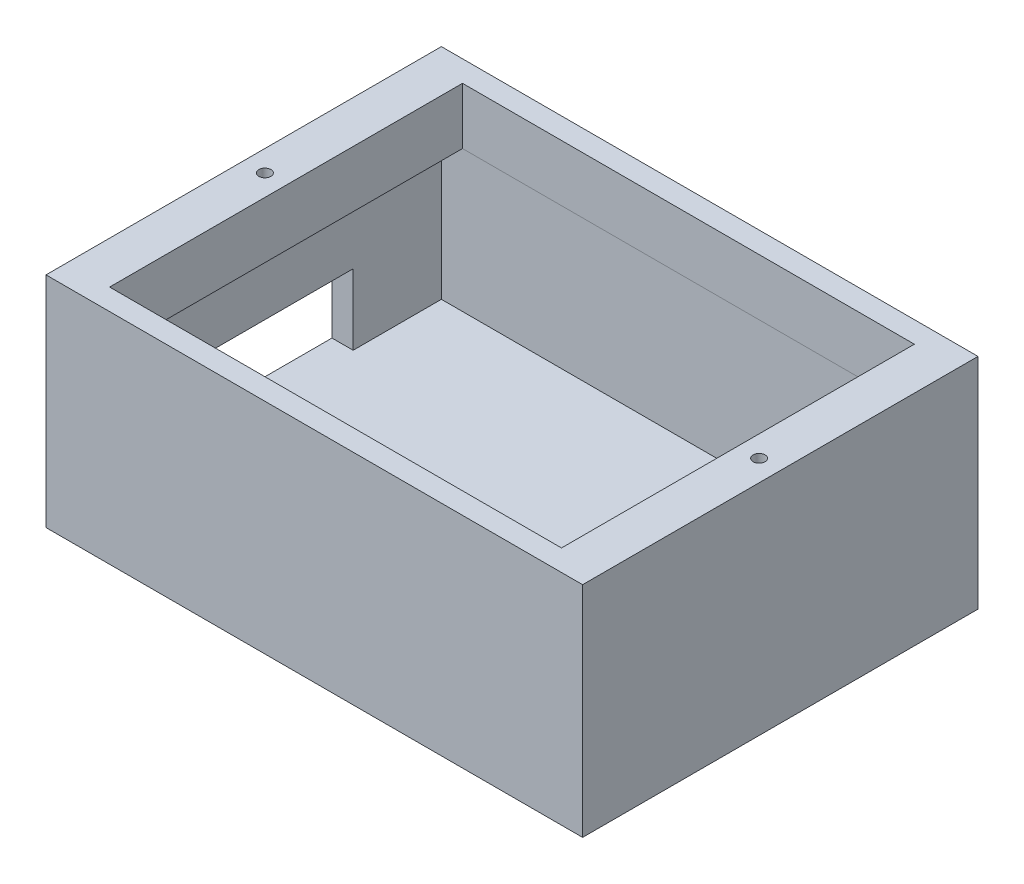
ISO-10303-21;
HEADER;
FILE_DESCRIPTION(('STEP AP214'),'2;1');
FILE_NAME('part.step','',(''),(''),'','','');
FILE_SCHEMA(('AUTOMOTIVE_DESIGN { 1 0 10303 214 1 1 1 1 }'));
ENDSEC;
DATA;
#1=APPLICATION_CONTEXT('core data for automotive mechanical design processes');
#2=APPLICATION_PROTOCOL_DEFINITION('international standard','automotive_design',2000,#1);
#3=PRODUCT_CONTEXT('',#1,'mechanical');
#4=PRODUCT('Part','Part','',(#3));
#5=PRODUCT_RELATED_PRODUCT_CATEGORY('part','',(#4));
#6=PRODUCT_DEFINITION_FORMATION('','',#4);
#7=PRODUCT_DEFINITION_CONTEXT('part definition',#1,'design');
#8=PRODUCT_DEFINITION('design','',#6,#7);
#9=PRODUCT_DEFINITION_SHAPE('','',#8);
#10=(LENGTH_UNIT() NAMED_UNIT(*) SI_UNIT(.MILLI.,.METRE.));
#11=(NAMED_UNIT(*) PLANE_ANGLE_UNIT() SI_UNIT($,.RADIAN.));
#12=(NAMED_UNIT(*) SI_UNIT($,.STERADIAN.) SOLID_ANGLE_UNIT());
#13=UNCERTAINTY_MEASURE_WITH_UNIT(LENGTH_MEASURE(1.E-05),#10,'distance_accuracy_value','');
#14=(GEOMETRIC_REPRESENTATION_CONTEXT(3) GLOBAL_UNCERTAINTY_ASSIGNED_CONTEXT((#13)) GLOBAL_UNIT_ASSIGNED_CONTEXT((#10,
#11,#12)) REPRESENTATION_CONTEXT('',''));
#15=CARTESIAN_POINT('',(0.,0.,0.));
#16=DIRECTION('',(0.,0.,1.));
#17=DIRECTION('',(1.,0.,0.));
#18=AXIS2_PLACEMENT_3D('',#15,#16,#17);
#19=CARTESIAN_POINT('',(-35.,31.,25.));
#20=DIRECTION('',(0.,0.,-1.));
#21=DIRECTION('',(-1.,0.,0.));
#22=AXIS2_PLACEMENT_3D('',#19,#20,#21);
#23=PLANE('',#22);
#24=DIRECTION('',(0.,-1.,0.));
#25=VECTOR('',#24,1.);
#26=CARTESIAN_POINT('',(-35.,31.,25.));
#27=LINE('',#26,#25);
#28=CARTESIAN_POINT('',(-35.,23.,25.));
#29=VERTEX_POINT('',#28);
#30=CARTESIAN_POINT('',(-35.,3.,25.));
#31=VERTEX_POINT('',#30);
#32=EDGE_CURVE('E244',#29,#31,#27,.T.);
#33=ORIENTED_EDGE('',*,*,#32,.F.);
#34=DIRECTION('',(1.,0.,0.));
#35=VECTOR('',#34,1.);
#36=CARTESIAN_POINT('',(0.,23.,25.));
#37=LINE('',#36,#35);
#38=CARTESIAN_POINT('',(35.,23.,25.));
#39=VERTEX_POINT('',#38);
#40=EDGE_CURVE('E51',#29,#39,#37,.T.);
#41=ORIENTED_EDGE('',*,*,#40,.T.);
#42=DIRECTION('',(0.,-1.,0.));
#43=VECTOR('',#42,1.);
#44=CARTESIAN_POINT('',(35.,31.,25.));
#45=LINE('',#44,#43);
#46=CARTESIAN_POINT('',(35.,3.,25.));
#47=VERTEX_POINT('',#46);
#48=EDGE_CURVE('E250',#39,#47,#45,.T.);
#49=ORIENTED_EDGE('',*,*,#48,.T.);
#50=DIRECTION('',(1.,0.,0.));
#51=VECTOR('',#50,1.);
#52=CARTESIAN_POINT('',(-35.,3.,25.));
#53=LINE('',#52,#51);
#54=EDGE_CURVE('E231',#31,#47,#53,.T.);
#55=ORIENTED_EDGE('',*,*,#54,.F.);
#56=EDGE_LOOP('',(#33,#41,#49,#55));
#57=FACE_BOUND('',#56,.T.);
#58=ADVANCED_FACE('F36',(#57),#23,.T.);
#59=CARTESIAN_POINT('',(35.,31.,25.));
#60=DIRECTION('',(-1.,0.,0.));
#61=DIRECTION('',(0.,0.,1.));
#62=AXIS2_PLACEMENT_3D('',#59,#60,#61);
#63=PLANE('',#62);
#64=ORIENTED_EDGE('',*,*,#48,.F.);
#65=DIRECTION('',(0.,0.,-1.));
#66=VECTOR('',#65,1.);
#67=CARTESIAN_POINT('',(35.,23.,0.));
#68=LINE('',#67,#66);
#69=CARTESIAN_POINT('',(35.,23.,-25.));
#70=VERTEX_POINT('',#69);
#71=EDGE_CURVE('E196',#39,#70,#68,.T.);
#72=ORIENTED_EDGE('',*,*,#71,.T.);
#73=DIRECTION('',(0.,-1.,0.));
#74=VECTOR('',#73,1.);
#75=CARTESIAN_POINT('',(35.,31.,-25.));
#76=LINE('',#75,#74);
#77=CARTESIAN_POINT('',(35.,3.,-25.));
#78=VERTEX_POINT('',#77);
#79=EDGE_CURVE('E248',#70,#78,#76,.T.);
#80=ORIENTED_EDGE('',*,*,#79,.T.);
#81=DIRECTION('',(0.,0.,-1.));
#82=VECTOR('',#81,1.);
#83=CARTESIAN_POINT('',(35.,3.,25.));
#84=LINE('',#83,#82);
#85=EDGE_CURVE('E234',#47,#78,#84,.T.);
#86=ORIENTED_EDGE('',*,*,#85,.F.);
#87=EDGE_LOOP('',(#64,#72,#80,#86));
#88=FACE_BOUND('',#87,.T.);
#89=ADVANCED_FACE('F307',(#88),#63,.T.);
#90=CARTESIAN_POINT('',(-35.,31.,-25.));
#91=DIRECTION('',(0.,0.,1.));
#92=DIRECTION('',(1.,0.,0.));
#93=AXIS2_PLACEMENT_3D('',#90,#91,#92);
#94=PLANE('',#93);
#95=ORIENTED_EDGE('',*,*,#79,.F.);
#96=DIRECTION('',(-1.,0.,0.));
#97=VECTOR('',#96,1.);
#98=CARTESIAN_POINT('',(0.,23.,-25.));
#99=LINE('',#98,#97);
#100=CARTESIAN_POINT('',(-35.,23.,-25.));
#101=VERTEX_POINT('',#100);
#102=EDGE_CURVE('E199',#70,#101,#99,.T.);
#103=ORIENTED_EDGE('',*,*,#102,.T.);
#104=DIRECTION('',(0.,-1.,0.));
#105=VECTOR('',#104,1.);
#106=CARTESIAN_POINT('',(-35.,31.,-25.));
#107=LINE('',#106,#105);
#108=CARTESIAN_POINT('',(-35.,3.,-25.));
#109=VERTEX_POINT('',#108);
#110=EDGE_CURVE('E246',#101,#109,#107,.T.);
#111=ORIENTED_EDGE('',*,*,#110,.T.);
#112=DIRECTION('',(-1.,0.,0.));
#113=VECTOR('',#112,1.);
#114=CARTESIAN_POINT('',(-35.,3.,-25.));
#115=LINE('',#114,#113);
#116=EDGE_CURVE('E237',#78,#109,#115,.T.);
#117=ORIENTED_EDGE('',*,*,#116,.F.);
#118=EDGE_LOOP('',(#95,#103,#111,#117));
#119=FACE_BOUND('',#118,.T.);
#120=ADVANCED_FACE('F313',(#119),#94,.T.);
#121=CARTESIAN_POINT('',(-35.,31.,25.));
#122=DIRECTION('',(1.,0.,0.));
#123=DIRECTION('',(0.,0.,-1.));
#124=AXIS2_PLACEMENT_3D('',#121,#122,#123);
#125=PLANE('',#124);
#126=ORIENTED_EDGE('',*,*,#110,.F.);
#127=DIRECTION('',(0.,0.,1.));
#128=VECTOR('',#127,1.);
#129=CARTESIAN_POINT('',(-35.,23.,0.));
#130=LINE('',#129,#128);
#131=EDGE_CURVE('E202',#101,#29,#130,.T.);
#132=ORIENTED_EDGE('',*,*,#131,.T.);
#133=ORIENTED_EDGE('',*,*,#32,.T.);
#134=DIRECTION('',(0.,0.,1.));
#135=VECTOR('',#134,1.);
#136=CARTESIAN_POINT('',(-35.,3.,25.));
#137=LINE('',#136,#135);
#138=CARTESIAN_POINT('',(-35.,3.,12.5));
#139=VERTEX_POINT('',#138);
#140=EDGE_CURVE('E240',#139,#31,#137,.T.);
#141=ORIENTED_EDGE('',*,*,#140,.F.);
#142=DIRECTION('',(0.,1.,0.));
#143=VECTOR('',#142,1.);
#144=CARTESIAN_POINT('',(-35.,3.,12.5));
#145=LINE('',#144,#143);
#146=CARTESIAN_POINT('',(-35.,13.,12.5));
#147=VERTEX_POINT('',#146);
#148=EDGE_CURVE('E207',#139,#147,#145,.T.);
#149=ORIENTED_EDGE('',*,*,#148,.T.);
#150=DIRECTION('',(0.,0.,-1.));
#151=VECTOR('',#150,1.);
#152=CARTESIAN_POINT('',(-35.,13.,-12.5));
#153=LINE('',#152,#151);
#154=CARTESIAN_POINT('',(-35.,13.,-12.5));
#155=VERTEX_POINT('',#154);
#156=EDGE_CURVE('E223',#147,#155,#153,.T.);
#157=ORIENTED_EDGE('',*,*,#156,.T.);
#158=DIRECTION('',(0.,-1.,0.));
#159=VECTOR('',#158,1.);
#160=CARTESIAN_POINT('',(-35.,3.,-12.5));
#161=LINE('',#160,#159);
#162=CARTESIAN_POINT('',(-35.,3.,-12.5));
#163=VERTEX_POINT('',#162);
#164=EDGE_CURVE('E204',#155,#163,#161,.T.);
#165=ORIENTED_EDGE('',*,*,#164,.T.);
#166=EDGE_CURVE('E241',#109,#163,#137,.T.);
#167=ORIENTED_EDGE('',*,*,#166,.F.);
#168=EDGE_LOOP('',(#126,#132,#133,#141,#149,#157,#165,#167));
#169=FACE_BOUND('',#168,.T.);
#170=ADVANCED_FACE('F305',(#169),#125,.T.);
#171=CARTESIAN_POINT('',(38.,3.,28.));
#172=DIRECTION('',(-1.,0.,0.));
#173=DIRECTION('',(0.,0.,1.));
#174=AXIS2_PLACEMENT_3D('',#171,#172,#173);
#175=PLANE('',#174);
#176=DIRECTION('',(0.,0.,-1.));
#177=VECTOR('',#176,1.);
#178=CARTESIAN_POINT('',(38.,0.,28.));
#179=LINE('',#178,#177);
#180=CARTESIAN_POINT('',(38.,0.,28.));
#181=VERTEX_POINT('',#180);
#182=CARTESIAN_POINT('',(38.,0.,-28.));
#183=VERTEX_POINT('',#182);
#184=EDGE_CURVE('E264',#181,#183,#179,.T.);
#185=ORIENTED_EDGE('',*,*,#184,.T.);
#186=DIRECTION('',(0.,-1.,0.));
#187=VECTOR('',#186,1.);
#188=CARTESIAN_POINT('',(38.,3.,-28.));
#189=LINE('',#188,#187);
#190=CARTESIAN_POINT('',(38.,31.,-28.));
#191=VERTEX_POINT('',#190);
#192=EDGE_CURVE('E11',#191,#183,#189,.T.);
#193=ORIENTED_EDGE('',*,*,#192,.F.);
#194=DIRECTION('',(0.,0.,-1.));
#195=VECTOR('',#194,1.);
#196=CARTESIAN_POINT('',(38.,31.,28.));
#197=LINE('',#196,#195);
#198=CARTESIAN_POINT('',(38.,31.,28.));
#199=VERTEX_POINT('',#198);
#200=EDGE_CURVE('E258',#199,#191,#197,.T.);
#201=ORIENTED_EDGE('',*,*,#200,.F.);
#202=DIRECTION('',(0.,-1.,0.));
#203=VECTOR('',#202,1.);
#204=CARTESIAN_POINT('',(38.,3.,28.));
#205=LINE('',#204,#203);
#206=EDGE_CURVE('E273',#199,#181,#205,.T.);
#207=ORIENTED_EDGE('',*,*,#206,.T.);
#208=EDGE_LOOP('',(#185,#193,#201,#207));
#209=FACE_BOUND('',#208,.T.);
#210=ADVANCED_FACE('F38',(#209),#175,.F.);
#211=CARTESIAN_POINT('',(-38.,3.,-28.));
#212=DIRECTION('',(0.,0.,1.));
#213=DIRECTION('',(1.,0.,0.));
#214=AXIS2_PLACEMENT_3D('',#211,#212,#213);
#215=PLANE('',#214);
#216=DIRECTION('',(-1.,0.,0.));
#217=VECTOR('',#216,1.);
#218=CARTESIAN_POINT('',(-38.,0.,-28.));
#219=LINE('',#218,#217);
#220=CARTESIAN_POINT('',(-38.,0.,-28.));
#221=VERTEX_POINT('',#220);
#222=EDGE_CURVE('E267',#183,#221,#219,.T.);
#223=ORIENTED_EDGE('',*,*,#222,.T.);
#224=DIRECTION('',(0.,-1.,0.));
#225=VECTOR('',#224,1.);
#226=CARTESIAN_POINT('',(-38.,3.,-28.));
#227=LINE('',#226,#225);
#228=CARTESIAN_POINT('',(-38.,31.,-28.));
#229=VERTEX_POINT('',#228);
#230=EDGE_CURVE('E44',#229,#221,#227,.T.);
#231=ORIENTED_EDGE('',*,*,#230,.F.);
#232=DIRECTION('',(-1.,0.,0.));
#233=VECTOR('',#232,1.);
#234=CARTESIAN_POINT('',(-38.,31.,-28.));
#235=LINE('',#234,#233);
#236=EDGE_CURVE('E261',#191,#229,#235,.T.);
#237=ORIENTED_EDGE('',*,*,#236,.F.);
#238=ORIENTED_EDGE('',*,*,#192,.T.);
#239=EDGE_LOOP('',(#223,#231,#237,#238));
#240=FACE_BOUND('',#239,.T.);
#241=ADVANCED_FACE('F297',(#240),#215,.F.);
#242=CARTESIAN_POINT('',(-38.,3.,28.));
#243=DIRECTION('',(1.,0.,0.));
#244=DIRECTION('',(0.,0.,-1.));
#245=AXIS2_PLACEMENT_3D('',#242,#243,#244);
#246=PLANE('',#245);
#247=DIRECTION('',(0.,-1.,0.));
#248=VECTOR('',#247,1.);
#249=CARTESIAN_POINT('',(-38.,3.,-12.5));
#250=LINE('',#249,#248);
#251=CARTESIAN_POINT('',(-38.,13.,-12.5));
#252=VERTEX_POINT('',#251);
#253=CARTESIAN_POINT('',(-38.,3.,-12.5));
#254=VERTEX_POINT('',#253);
#255=EDGE_CURVE('E216',#252,#254,#250,.T.);
#256=ORIENTED_EDGE('',*,*,#255,.F.);
#257=DIRECTION('',(0.,0.,-1.));
#258=VECTOR('',#257,1.);
#259=CARTESIAN_POINT('',(-38.,13.,-12.5));
#260=LINE('',#259,#258);
#261=CARTESIAN_POINT('',(-38.,13.,12.5));
#262=VERTEX_POINT('',#261);
#263=EDGE_CURVE('E213',#262,#252,#260,.T.);
#264=ORIENTED_EDGE('',*,*,#263,.F.);
#265=DIRECTION('',(0.,1.,0.));
#266=VECTOR('',#265,1.);
#267=CARTESIAN_POINT('',(-38.,3.,12.5));
#268=LINE('',#267,#266);
#269=CARTESIAN_POINT('',(-38.,3.,12.5));
#270=VERTEX_POINT('',#269);
#271=EDGE_CURVE('E210',#270,#262,#268,.T.);
#272=ORIENTED_EDGE('',*,*,#271,.F.);
#273=DIRECTION('',(0.,0.,1.));
#274=VECTOR('',#273,1.);
#275=CARTESIAN_POINT('',(-38.,3.,-12.5));
#276=LINE('',#275,#274);
#277=EDGE_CURVE('E59',#254,#270,#276,.T.);
#278=ORIENTED_EDGE('',*,*,#277,.F.);
#279=EDGE_LOOP('',(#256,#264,#272,#278));
#280=FACE_BOUND('',#279,.T.);
#281=DIRECTION('',(0.,0.,1.));
#282=VECTOR('',#281,1.);
#283=CARTESIAN_POINT('',(-38.,0.,28.));
#284=LINE('',#283,#282);
#285=CARTESIAN_POINT('',(-38.,0.,28.));
#286=VERTEX_POINT('',#285);
#287=EDGE_CURVE('E269',#221,#286,#284,.T.);
#288=ORIENTED_EDGE('',*,*,#287,.T.);
#289=DIRECTION('',(0.,-1.,0.));
#290=VECTOR('',#289,1.);
#291=CARTESIAN_POINT('',(-38.,3.,28.));
#292=LINE('',#291,#290);
#293=CARTESIAN_POINT('',(-38.,31.,28.));
#294=VERTEX_POINT('',#293);
#295=EDGE_CURVE('E276',#294,#286,#292,.T.);
#296=ORIENTED_EDGE('',*,*,#295,.F.);
#297=DIRECTION('',(0.,0.,1.));
#298=VECTOR('',#297,1.);
#299=CARTESIAN_POINT('',(-38.,31.,28.));
#300=LINE('',#299,#298);
#301=EDGE_CURVE('E252',#229,#294,#300,.T.);
#302=ORIENTED_EDGE('',*,*,#301,.F.);
#303=ORIENTED_EDGE('',*,*,#230,.T.);
#304=EDGE_LOOP('',(#288,#296,#302,#303));
#305=FACE_BOUND('',#304,.T.);
#306=ADVANCED_FACE('F282',(#280,#305),#246,.F.);
#307=CARTESIAN_POINT('',(-38.,3.,28.));
#308=DIRECTION('',(0.,0.,-1.));
#309=DIRECTION('',(-1.,0.,0.));
#310=AXIS2_PLACEMENT_3D('',#307,#308,#309);
#311=PLANE('',#310);
#312=DIRECTION('',(1.,0.,0.));
#313=VECTOR('',#312,1.);
#314=CARTESIAN_POINT('',(-38.,0.,28.));
#315=LINE('',#314,#313);
#316=EDGE_CURVE('E271',#286,#181,#315,.T.);
#317=ORIENTED_EDGE('',*,*,#316,.T.);
#318=ORIENTED_EDGE('',*,*,#206,.F.);
#319=DIRECTION('',(1.,0.,0.));
#320=VECTOR('',#319,1.);
#321=CARTESIAN_POINT('',(-38.,31.,28.));
#322=LINE('',#321,#320);
#323=EDGE_CURVE('E255',#294,#199,#322,.T.);
#324=ORIENTED_EDGE('',*,*,#323,.F.);
#325=ORIENTED_EDGE('',*,*,#295,.T.);
#326=EDGE_LOOP('',(#317,#318,#324,#325));
#327=FACE_BOUND('',#326,.T.);
#328=ADVANCED_FACE('F290',(#327),#311,.F.);
#329=CARTESIAN_POINT('',(0.,0.,0.));
#330=DIRECTION('',(0.,-1.,0.));
#331=DIRECTION('',(0.,0.,-1.));
#332=AXIS2_PLACEMENT_3D('',#329,#330,#331);
#333=PLANE('',#332);
#334=ORIENTED_EDGE('',*,*,#184,.F.);
#335=ORIENTED_EDGE('',*,*,#316,.F.);
#336=ORIENTED_EDGE('',*,*,#287,.F.);
#337=ORIENTED_EDGE('',*,*,#222,.F.);
#338=EDGE_LOOP('',(#334,#335,#336,#337));
#339=FACE_BOUND('',#338,.T.);
#340=ADVANCED_FACE('F288',(#339),#333,.T.);
#341=CARTESIAN_POINT('',(0.,31.,0.));
#342=DIRECTION('',(0.,-1.,0.));
#343=DIRECTION('',(0.,0.,-1.));
#344=AXIS2_PLACEMENT_3D('',#341,#342,#343);
#345=PLANE('',#344);
#346=CARTESIAN_POINT('',(-35.,31.,0.));
#347=DIRECTION('',(0.,1.,0.));
#348=DIRECTION('',(0.,0.,1.));
#349=AXIS2_PLACEMENT_3D('',#346,#347,#348);
#350=CIRCLE('',#349,0.849999999999999);
#351=CARTESIAN_POINT('',(-35.,31.,0.849999999999999));
#352=VERTEX_POINT('',#351);
#353=EDGE_CURVE('E544',#352,#352,#350,.T.);
#354=ORIENTED_EDGE('',*,*,#353,.F.);
#355=EDGE_LOOP('',(#354));
#356=FACE_BOUND('',#355,.T.);
#357=CARTESIAN_POINT('',(35.,31.,0.));
#358=DIRECTION('',(0.,1.,0.));
#359=DIRECTION('',(0.,0.,-1.));
#360=AXIS2_PLACEMENT_3D('',#357,#358,#359);
#361=CIRCLE('',#360,0.849999999999999);
#362=CARTESIAN_POINT('',(35.,31.,-0.849999999999999));
#363=VERTEX_POINT('',#362);
#364=EDGE_CURVE('E179',#363,#363,#361,.T.);
#365=ORIENTED_EDGE('',*,*,#364,.F.);
#366=EDGE_LOOP('',(#365));
#367=FACE_BOUND('',#366,.T.);
#368=ORIENTED_EDGE('',*,*,#301,.T.);
#369=ORIENTED_EDGE('',*,*,#323,.T.);
#370=ORIENTED_EDGE('',*,*,#200,.T.);
#371=ORIENTED_EDGE('',*,*,#236,.T.);
#372=EDGE_LOOP('',(#368,#369,#370,#371));
#373=FACE_BOUND('',#372,.T.);
#374=DIRECTION('',(1.,0.,0.));
#375=VECTOR('',#374,1.);
#376=CARTESIAN_POINT('',(0.,31.,24.99));
#377=LINE('',#376,#375);
#378=CARTESIAN_POINT('',(-32.,31.,24.99));
#379=VERTEX_POINT('',#378);
#380=CARTESIAN_POINT('',(32.,31.,24.99));
#381=VERTEX_POINT('',#380);
#382=EDGE_CURVE('E156',#379,#381,#377,.T.);
#383=ORIENTED_EDGE('',*,*,#382,.F.);
#384=DIRECTION('',(0.,0.,1.));
#385=VECTOR('',#384,1.);
#386=CARTESIAN_POINT('',(-32.,31.,0.));
#387=LINE('',#386,#385);
#388=CARTESIAN_POINT('',(-32.,31.,-24.99));
#389=VERTEX_POINT('',#388);
#390=EDGE_CURVE('E173',#389,#379,#387,.T.);
#391=ORIENTED_EDGE('',*,*,#390,.F.);
#392=DIRECTION('',(-1.,0.,0.));
#393=VECTOR('',#392,1.);
#394=CARTESIAN_POINT('',(0.,31.,-24.99));
#395=LINE('',#394,#393);
#396=CARTESIAN_POINT('',(32.,31.,-24.99));
#397=VERTEX_POINT('',#396);
#398=EDGE_CURVE('E176',#397,#389,#395,.T.);
#399=ORIENTED_EDGE('',*,*,#398,.F.);
#400=DIRECTION('',(0.,0.,-1.));
#401=VECTOR('',#400,1.);
#402=CARTESIAN_POINT('',(32.,31.,0.));
#403=LINE('',#402,#401);
#404=EDGE_CURVE('E185',#381,#397,#403,.T.);
#405=ORIENTED_EDGE('',*,*,#404,.F.);
#406=EDGE_LOOP('',(#383,#391,#399,#405));
#407=FACE_BOUND('',#406,.T.);
#408=ADVANCED_FACE('F295',(#356,#367,#373,#407),#345,.F.);
#409=CARTESIAN_POINT('',(0.,3.,0.));
#410=DIRECTION('',(0.,-1.,0.));
#411=DIRECTION('',(0.,0.,-1.));
#412=AXIS2_PLACEMENT_3D('',#409,#410,#411);
#413=PLANE('',#412);
#414=ORIENTED_EDGE('',*,*,#166,.T.);
#415=DIRECTION('',(-1.,0.,0.));
#416=VECTOR('',#415,1.);
#417=CARTESIAN_POINT('',(38.001,3.,-12.5));
#418=LINE('',#417,#416);
#419=EDGE_CURVE('E224',#163,#254,#418,.T.);
#420=ORIENTED_EDGE('',*,*,#419,.T.);
#421=ORIENTED_EDGE('',*,*,#277,.T.);
#422=DIRECTION('',(-1.,0.,0.));
#423=VECTOR('',#422,1.);
#424=CARTESIAN_POINT('',(38.001,3.,12.5));
#425=LINE('',#424,#423);
#426=EDGE_CURVE('E221',#139,#270,#425,.T.);
#427=ORIENTED_EDGE('',*,*,#426,.F.);
#428=ORIENTED_EDGE('',*,*,#140,.T.);
#429=ORIENTED_EDGE('',*,*,#54,.T.);
#430=ORIENTED_EDGE('',*,*,#85,.T.);
#431=ORIENTED_EDGE('',*,*,#116,.T.);
#432=EDGE_LOOP('',(#414,#420,#421,#427,#428,#429,#430,#431));
#433=FACE_BOUND('',#432,.T.);
#434=ADVANCED_FACE('F321',(#433),#413,.F.);
#435=CARTESIAN_POINT('',(38.001,13.,-12.5));
#436=DIRECTION('',(0.,1.,0.));
#437=DIRECTION('',(0.,0.,1.));
#438=AXIS2_PLACEMENT_3D('',#435,#436,#437);
#439=PLANE('',#438);
#440=DIRECTION('',(-1.,0.,0.));
#441=VECTOR('',#440,1.);
#442=CARTESIAN_POINT('',(38.001,13.,12.5));
#443=LINE('',#442,#441);
#444=EDGE_CURVE('E220',#147,#262,#443,.T.);
#445=ORIENTED_EDGE('',*,*,#444,.T.);
#446=ORIENTED_EDGE('',*,*,#263,.T.);
#447=DIRECTION('',(-1.,0.,0.));
#448=VECTOR('',#447,1.);
#449=CARTESIAN_POINT('',(38.001,13.,-12.5));
#450=LINE('',#449,#448);
#451=EDGE_CURVE('E226',#155,#252,#450,.T.);
#452=ORIENTED_EDGE('',*,*,#451,.F.);
#453=ORIENTED_EDGE('',*,*,#156,.F.);
#454=EDGE_LOOP('',(#445,#446,#452,#453));
#455=FACE_BOUND('',#454,.T.);
#456=ADVANCED_FACE('F325',(#455),#439,.F.);
#457=CARTESIAN_POINT('',(38.001,3.,-12.5));
#458=DIRECTION('',(0.,0.,-1.));
#459=DIRECTION('',(0.,1.,0.));
#460=AXIS2_PLACEMENT_3D('',#457,#458,#459);
#461=PLANE('',#460);
#462=ORIENTED_EDGE('',*,*,#451,.T.);
#463=ORIENTED_EDGE('',*,*,#255,.T.);
#464=ORIENTED_EDGE('',*,*,#419,.F.);
#465=ORIENTED_EDGE('',*,*,#164,.F.);
#466=EDGE_LOOP('',(#462,#463,#464,#465));
#467=FACE_BOUND('',#466,.T.);
#468=ADVANCED_FACE('F354',(#467),#461,.F.);
#469=CARTESIAN_POINT('',(38.001,3.,12.5));
#470=DIRECTION('',(0.,0.,1.));
#471=DIRECTION('',(1.,0.,0.));
#472=AXIS2_PLACEMENT_3D('',#469,#470,#471);
#473=PLANE('',#472);
#474=ORIENTED_EDGE('',*,*,#426,.T.);
#475=ORIENTED_EDGE('',*,*,#271,.T.);
#476=ORIENTED_EDGE('',*,*,#444,.F.);
#477=ORIENTED_EDGE('',*,*,#148,.F.);
#478=EDGE_LOOP('',(#474,#475,#476,#477));
#479=FACE_BOUND('',#478,.T.);
#480=ADVANCED_FACE('F362',(#479),#473,.F.);
#481=CARTESIAN_POINT('',(0.,23.,0.));
#482=DIRECTION('',(0.,1.,0.));
#483=DIRECTION('',(0.,0.,1.));
#484=AXIS2_PLACEMENT_3D('',#481,#482,#483);
#485=PLANE('',#484);
#486=DIRECTION('',(0.,0.,1.));
#487=VECTOR('',#486,1.);
#488=CARTESIAN_POINT('',(-32.,23.,0.));
#489=LINE('',#488,#487);
#490=CARTESIAN_POINT('',(-32.,23.,-24.99));
#491=VERTEX_POINT('',#490);
#492=CARTESIAN_POINT('',(-32.,23.,24.99));
#493=VERTEX_POINT('',#492);
#494=EDGE_CURVE('E161',#491,#493,#489,.T.);
#495=ORIENTED_EDGE('',*,*,#494,.T.);
#496=DIRECTION('',(1.,0.,0.));
#497=VECTOR('',#496,1.);
#498=CARTESIAN_POINT('',(0.,23.,24.99));
#499=LINE('',#498,#497);
#500=CARTESIAN_POINT('',(32.,23.,24.99));
#501=VERTEX_POINT('',#500);
#502=EDGE_CURVE('E153',#493,#501,#499,.T.);
#503=ORIENTED_EDGE('',*,*,#502,.T.);
#504=DIRECTION('',(0.,0.,-1.));
#505=VECTOR('',#504,1.);
#506=CARTESIAN_POINT('',(32.,23.,0.));
#507=LINE('',#506,#505);
#508=CARTESIAN_POINT('',(32.,23.,-24.99));
#509=VERTEX_POINT('',#508);
#510=EDGE_CURVE('E165',#501,#509,#507,.T.);
#511=ORIENTED_EDGE('',*,*,#510,.T.);
#512=DIRECTION('',(-1.,0.,0.));
#513=VECTOR('',#512,1.);
#514=CARTESIAN_POINT('',(0.,23.,-24.99));
#515=LINE('',#514,#513);
#516=EDGE_CURVE('E169',#509,#491,#515,.T.);
#517=ORIENTED_EDGE('',*,*,#516,.T.);
#518=EDGE_LOOP('',(#495,#503,#511,#517));
#519=FACE_BOUND('',#518,.T.);
#520=ORIENTED_EDGE('',*,*,#40,.F.);
#521=ORIENTED_EDGE('',*,*,#131,.F.);
#522=ORIENTED_EDGE('',*,*,#102,.F.);
#523=ORIENTED_EDGE('',*,*,#71,.F.);
#524=EDGE_LOOP('',(#520,#521,#522,#523));
#525=FACE_BOUND('',#524,.T.);
#526=ADVANCED_FACE('F171',(#519,#525),#485,.F.);
#527=CARTESIAN_POINT('',(0.,23.,24.99));
#528=DIRECTION('',(0.,0.,1.));
#529=DIRECTION('',(1.,0.,0.));
#530=AXIS2_PLACEMENT_3D('',#527,#528,#529);
#531=PLANE('',#530);
#532=ORIENTED_EDGE('',*,*,#382,.T.);
#533=DIRECTION('',(0.,1.,0.));
#534=VECTOR('',#533,1.);
#535=CARTESIAN_POINT('',(32.,23.,24.99));
#536=LINE('',#535,#534);
#537=EDGE_CURVE('E149',#501,#381,#536,.T.);
#538=ORIENTED_EDGE('',*,*,#537,.F.);
#539=ORIENTED_EDGE('',*,*,#502,.F.);
#540=DIRECTION('',(0.,1.,0.));
#541=VECTOR('',#540,1.);
#542=CARTESIAN_POINT('',(-32.,23.,24.99));
#543=LINE('',#542,#541);
#544=EDGE_CURVE('E190',#493,#379,#543,.T.);
#545=ORIENTED_EDGE('',*,*,#544,.T.);
#546=EDGE_LOOP('',(#532,#538,#539,#545));
#547=FACE_BOUND('',#546,.T.);
#548=ADVANCED_FACE('F151',(#547),#531,.F.);
#549=CARTESIAN_POINT('',(-32.,23.,0.));
#550=DIRECTION('',(-1.,0.,0.));
#551=DIRECTION('',(0.,0.,1.));
#552=AXIS2_PLACEMENT_3D('',#549,#550,#551);
#553=PLANE('',#552);
#554=ORIENTED_EDGE('',*,*,#390,.T.);
#555=ORIENTED_EDGE('',*,*,#544,.F.);
#556=ORIENTED_EDGE('',*,*,#494,.F.);
#557=DIRECTION('',(0.,1.,0.));
#558=VECTOR('',#557,1.);
#559=CARTESIAN_POINT('',(-32.,23.,-24.99));
#560=LINE('',#559,#558);
#561=EDGE_CURVE('E192',#491,#389,#560,.T.);
#562=ORIENTED_EDGE('',*,*,#561,.T.);
#563=EDGE_LOOP('',(#554,#555,#556,#562));
#564=FACE_BOUND('',#563,.T.);
#565=ADVANCED_FACE('F384',(#564),#553,.F.);
#566=CARTESIAN_POINT('',(0.,23.,-24.99));
#567=DIRECTION('',(0.,0.,-1.));
#568=DIRECTION('',(-1.,0.,0.));
#569=AXIS2_PLACEMENT_3D('',#566,#567,#568);
#570=PLANE('',#569);
#571=ORIENTED_EDGE('',*,*,#398,.T.);
#572=ORIENTED_EDGE('',*,*,#561,.F.);
#573=ORIENTED_EDGE('',*,*,#516,.F.);
#574=DIRECTION('',(0.,1.,0.));
#575=VECTOR('',#574,1.);
#576=CARTESIAN_POINT('',(32.,23.,-24.99));
#577=LINE('',#576,#575);
#578=EDGE_CURVE('E160',#509,#397,#577,.T.);
#579=ORIENTED_EDGE('',*,*,#578,.T.);
#580=EDGE_LOOP('',(#571,#572,#573,#579));
#581=FACE_BOUND('',#580,.T.);
#582=ADVANCED_FACE('F391',(#581),#570,.F.);
#583=CARTESIAN_POINT('',(32.,23.,0.));
#584=DIRECTION('',(1.,0.,0.));
#585=DIRECTION('',(0.,0.,-1.));
#586=AXIS2_PLACEMENT_3D('',#583,#584,#585);
#587=PLANE('',#586);
#588=ORIENTED_EDGE('',*,*,#404,.T.);
#589=ORIENTED_EDGE('',*,*,#578,.F.);
#590=ORIENTED_EDGE('',*,*,#510,.F.);
#591=ORIENTED_EDGE('',*,*,#537,.T.);
#592=EDGE_LOOP('',(#588,#589,#590,#591));
#593=FACE_BOUND('',#592,.T.);
#594=ADVANCED_FACE('F166',(#593),#587,.F.);
#595=CARTESIAN_POINT('',(35.,26.,0.));
#596=DIRECTION('',(0.,1.,0.));
#597=DIRECTION('',(0.,0.,1.));
#598=AXIS2_PLACEMENT_3D('',#595,#596,#597);
#599=CYLINDRICAL_SURFACE('',#598,0.849999999999999);
#600=CARTESIAN_POINT('',(35.,26.,0.));
#601=DIRECTION('',(0.,1.,0.));
#602=DIRECTION('',(0.,0.,-1.));
#603=AXIS2_PLACEMENT_3D('',#600,#601,#602);
#604=CIRCLE('',#603,0.849999999999999);
#605=CARTESIAN_POINT('',(35.,26.,-0.849999999999999));
#606=VERTEX_POINT('',#605);
#607=EDGE_CURVE('E547',#606,#606,#604,.T.);
#608=ORIENTED_EDGE('',*,*,#607,.F.);
#609=EDGE_LOOP('',(#608));
#610=FACE_BOUND('',#609,.T.);
#611=ORIENTED_EDGE('',*,*,#364,.T.);
#612=EDGE_LOOP('',(#611));
#613=FACE_BOUND('',#612,.T.);
#614=ADVANCED_FACE('F405',(#610,#613),#599,.F.);
#615=CARTESIAN_POINT('',(35.,26.,0.));
#616=DIRECTION('',(0.,-1.,0.));
#617=DIRECTION('',(0.,0.,-1.));
#618=AXIS2_PLACEMENT_3D('',#615,#616,#617);
#619=PLANE('',#618);
#620=ORIENTED_EDGE('',*,*,#607,.T.);
#621=EDGE_LOOP('',(#620));
#622=FACE_BOUND('',#621,.T.);
#623=ADVANCED_FACE('F411',(#622),#619,.F.);
#624=CARTESIAN_POINT('',(-35.,26.,0.));
#625=DIRECTION('',(0.,1.,0.));
#626=DIRECTION('',(0.,0.,1.));
#627=AXIS2_PLACEMENT_3D('',#624,#625,#626);
#628=CYLINDRICAL_SURFACE('',#627,0.849999999999999);
#629=CARTESIAN_POINT('',(-35.,26.,0.));
#630=DIRECTION('',(0.,1.,0.));
#631=DIRECTION('',(0.,0.,1.));
#632=AXIS2_PLACEMENT_3D('',#629,#630,#631);
#633=CIRCLE('',#632,0.849999999999999);
#634=CARTESIAN_POINT('',(-35.,26.,0.849999999999999));
#635=VERTEX_POINT('',#634);
#636=EDGE_CURVE('E186',#635,#635,#633,.T.);
#637=ORIENTED_EDGE('',*,*,#636,.F.);
#638=EDGE_LOOP('',(#637));
#639=FACE_BOUND('',#638,.T.);
#640=ORIENTED_EDGE('',*,*,#353,.T.);
#641=EDGE_LOOP('',(#640));
#642=FACE_BOUND('',#641,.T.);
#643=ADVANCED_FACE('F419',(#639,#642),#628,.F.);
#644=CARTESIAN_POINT('',(-35.,26.,0.));
#645=DIRECTION('',(0.,1.,0.));
#646=DIRECTION('',(0.,0.,1.));
#647=AXIS2_PLACEMENT_3D('',#644,#645,#646);
#648=PLANE('',#647);
#649=ORIENTED_EDGE('',*,*,#636,.T.);
#650=EDGE_LOOP('',(#649));
#651=FACE_BOUND('',#650,.T.);
#652=ADVANCED_FACE('F427',(#651),#648,.T.);
#653=CLOSED_SHELL('',(#58,#89,#120,#170,#210,#241,#306,#328,#340,#408,#434,#456,#468,#480,#526,
#548,#565,#582,#594,#614,#623,#643,#652));
#654=MANIFOLD_SOLID_BREP('B2',#653);
#655=ADVANCED_BREP_SHAPE_REPRESENTATION('',(#18,#654),#14);
#656=SHAPE_DEFINITION_REPRESENTATION(#9,#655);
ENDSEC;
END-ISO-10303-21;
